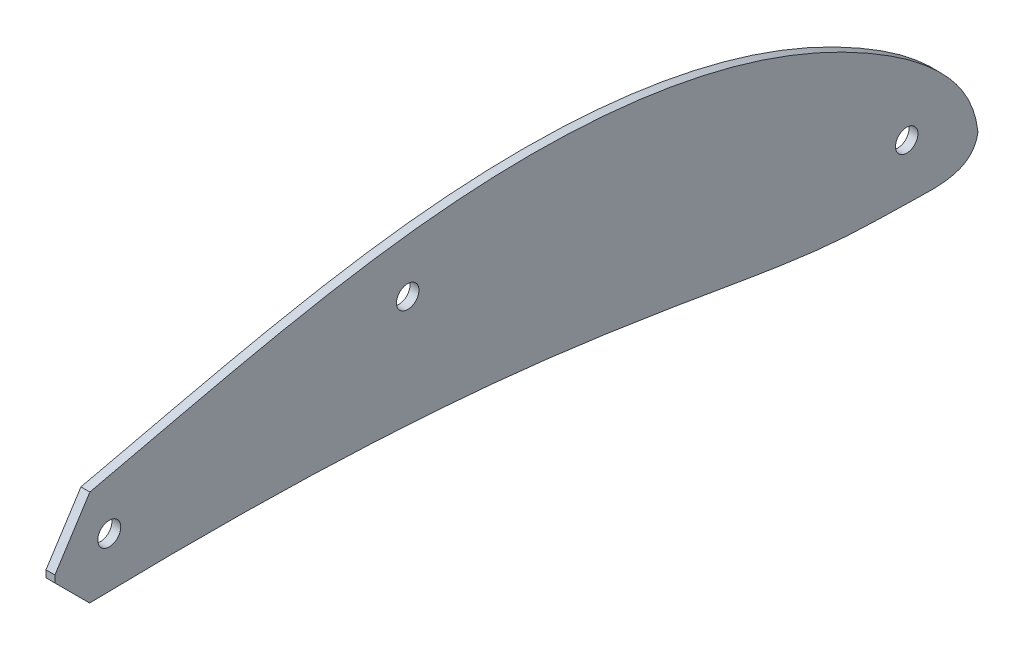
ISO-10303-21;
HEADER;
FILE_DESCRIPTION(('STEP AP214'),'2;1');
FILE_NAME('part.step','',(''),(''),'','','');
FILE_SCHEMA(('AUTOMOTIVE_DESIGN { 1 0 10303 214 1 1 1 1 }'));
ENDSEC;
DATA;
#1=APPLICATION_CONTEXT('core data for automotive mechanical design processes');
#2=APPLICATION_PROTOCOL_DEFINITION('international standard','automotive_design',2000,#1);
#3=PRODUCT_CONTEXT('',#1,'mechanical');
#4=PRODUCT('Part','Part','',(#3));
#5=PRODUCT_RELATED_PRODUCT_CATEGORY('part','',(#4));
#6=PRODUCT_DEFINITION_FORMATION('','',#4);
#7=PRODUCT_DEFINITION_CONTEXT('part definition',#1,'design');
#8=PRODUCT_DEFINITION('design','',#6,#7);
#9=PRODUCT_DEFINITION_SHAPE('','',#8);
#10=(LENGTH_UNIT() NAMED_UNIT(*) SI_UNIT(.MILLI.,.METRE.));
#11=(NAMED_UNIT(*) PLANE_ANGLE_UNIT() SI_UNIT($,.RADIAN.));
#12=(NAMED_UNIT(*) SI_UNIT($,.STERADIAN.) SOLID_ANGLE_UNIT());
#13=UNCERTAINTY_MEASURE_WITH_UNIT(LENGTH_MEASURE(1.E-05),#10,'distance_accuracy_value','');
#14=(GEOMETRIC_REPRESENTATION_CONTEXT(3) GLOBAL_UNCERTAINTY_ASSIGNED_CONTEXT((#13)) GLOBAL_UNIT_ASSIGNED_CONTEXT((#10,
#11,#12)) REPRESENTATION_CONTEXT('',''));
#15=CARTESIAN_POINT('',(0.,0.,0.));
#16=DIRECTION('',(0.,0.,1.));
#17=DIRECTION('',(1.,0.,0.));
#18=AXIS2_PLACEMENT_3D('',#15,#16,#17);
#19=CARTESIAN_POINT('',(51.564,15.4406002606928,222.336628160272));
#20=DIRECTION('',(0.,1.44492661498854E-12,-1.));
#21=DIRECTION('',(0.,1.,1.44492661498854E-12));
#22=AXIS2_PLACEMENT_3D('',#19,#20,#21);
#23=PLANE('',#22);
#24=DIRECTION('',(0.,-1.,-1.44492661498854E-12));
#25=VECTOR('',#24,1.);
#26=CARTESIAN_POINT('',(-252.4125,15.4406002606927,222.336628160272));
#27=LINE('',#26,#25);
#28=CARTESIAN_POINT('',(-252.4125,19.7638716183474,222.336628160278));
#29=VERTEX_POINT('',#28);
#30=CARTESIAN_POINT('',(-252.4125,18.5250725821856,222.336628160277));
#31=VERTEX_POINT('',#30);
#32=EDGE_CURVE('E617',#29,#31,#27,.T.);
#33=ORIENTED_EDGE('',*,*,#32,.F.);
#34=DIRECTION('',(-1.,0.,0.));
#35=VECTOR('',#34,1.);
#36=CARTESIAN_POINT('',(51.564,19.7638716183474,222.336628160278));
#37=LINE('',#36,#35);
#38=CARTESIAN_POINT('',(-254.,19.7638716183474,222.336628160278));
#39=VERTEX_POINT('',#38);
#40=EDGE_CURVE('E626',#29,#39,#37,.T.);
#41=ORIENTED_EDGE('',*,*,#40,.T.);
#42=DIRECTION('',(0.,-1.,-1.44993065840349E-12));
#43=VECTOR('',#42,1.);
#44=CARTESIAN_POINT('',(-254.,24.8516053073634,222.336628160286));
#45=LINE('',#44,#43);
#46=CARTESIAN_POINT('',(-254.,18.5250725821856,222.336628160277));
#47=VERTEX_POINT('',#46);
#48=EDGE_CURVE('E650',#39,#47,#45,.T.);
#49=ORIENTED_EDGE('',*,*,#48,.T.);
#50=DIRECTION('',(1.,0.,0.));
#51=VECTOR('',#50,1.);
#52=CARTESIAN_POINT('',(51.564,18.5250725821856,222.336628160277));
#53=LINE('',#52,#51);
#54=EDGE_CURVE('E628',#47,#31,#53,.T.);
#55=ORIENTED_EDGE('',*,*,#54,.T.);
#56=EDGE_LOOP('',(#33,#41,#49,#55));
#57=FACE_BOUND('',#56,.T.);
#58=ADVANCED_FACE('F565',(#57),#23,.F.);
#59=CARTESIAN_POINT('',(51.564,5.89579588539861,57.8876602686386));
#60=CARTESIAN_POINT('',(51.564,11.4375298185041,58.4977039922272));
#61=CARTESIAN_POINT('',(51.564,19.3424786806868,64.4003558423215));
#62=CARTESIAN_POINT('',(51.564,28.468473074538,77.6824198998625));
#63=CARTESIAN_POINT('',(51.564,37.5748623123411,97.1285534265328));
#64=CARTESIAN_POINT('',(51.564,43.0194934329442,125.362969322304));
#65=CARTESIAN_POINT('',(51.564,41.5069186372436,169.207920796175));
#66=CARTESIAN_POINT('',(51.564,32.6348292698958,201.329645296342));
#67=CARTESIAN_POINT('',(51.564,28.067577517069,222.336628160291));
#68=B_SPLINE_CURVE_WITH_KNOTS('',3,(#59,#60,#61,#62,#63,#64,#65,#66,#67),.UNSPECIFIED.,.F.,.F.,
(4,1,1,1,1,1,4),(0.,0.0865869930935198,0.16173742787457,0.268322265449627,0.445156626621206,
0.638028872876503,1.),.UNSPECIFIED.);
#69=DIRECTION('',(-1.,0.,0.));
#70=VECTOR('',#69,1.);
#71=SURFACE_OF_LINEAR_EXTRUSION('',#68,#70);
#72=CARTESIAN_POINT('',(-252.4125,5.89579588539861,57.8876602686386));
#73=CARTESIAN_POINT('',(-252.4125,11.4375298185041,58.4977039922272));
#74=CARTESIAN_POINT('',(-252.4125,19.3424786806868,64.4003558423215));
#75=CARTESIAN_POINT('',(-252.4125,28.468473074538,77.6824198998625));
#76=CARTESIAN_POINT('',(-252.4125,37.5748623123411,97.1285534265328));
#77=CARTESIAN_POINT('',(-252.4125,43.0194934329442,125.362969322304));
#78=CARTESIAN_POINT('',(-252.4125,41.5069186372436,169.207920796175));
#79=CARTESIAN_POINT('',(-252.4125,32.6348292698958,201.329645296342));
#80=CARTESIAN_POINT('',(-252.4125,28.067577517069,222.336628160291));
#81=B_SPLINE_CURVE_WITH_KNOTS('',3,(#72,#73,#74,#75,#76,#77,#78,#79,#80),.UNSPECIFIED.,.F.,.F.,
(4,1,1,1,1,1,4),(0.,0.0865869930935198,0.16173742787457,0.268322265449627,0.445156626621206,
0.638028872876503,1.),.UNSPECIFIED.);
#82=CARTESIAN_POINT('',(-252.4125,5.89579588539861,57.8876602686386));
#83=VERTEX_POINT('',#82);
#84=CARTESIAN_POINT('',(-252.4125,29.453439208678,216.107941821354));
#85=VERTEX_POINT('',#84);
#86=EDGE_CURVE('E584',#83,#85,#81,.T.);
#87=ORIENTED_EDGE('',*,*,#86,.F.);
#88=DIRECTION('',(-1.,0.,0.));
#89=VECTOR('',#88,1.);
#90=CARTESIAN_POINT('',(51.564,5.89579588539861,57.8876602686386));
#91=LINE('',#90,#89);
#92=CARTESIAN_POINT('',(-254.,5.89579588539861,57.8876602686386));
#93=VERTEX_POINT('',#92);
#94=EDGE_CURVE('E570',#83,#93,#91,.T.);
#95=ORIENTED_EDGE('',*,*,#94,.T.);
#96=CARTESIAN_POINT('',(-254.,5.89579588539861,57.8876602686386));
#97=CARTESIAN_POINT('',(-254.,11.4375298185041,58.4977039922272));
#98=CARTESIAN_POINT('',(-254.,19.3424786806868,64.4003558423215));
#99=CARTESIAN_POINT('',(-254.,28.468473074538,77.6824198998625));
#100=CARTESIAN_POINT('',(-254.,37.5748623123411,97.1285534265328));
#101=CARTESIAN_POINT('',(-254.,43.0194934329442,125.362969322304));
#102=CARTESIAN_POINT('',(-254.,41.5069186372436,169.207920796175));
#103=CARTESIAN_POINT('',(-254.,32.6348292698958,201.329645296342));
#104=CARTESIAN_POINT('',(-254.,28.067577517069,222.336628160291));
#105=B_SPLINE_CURVE_WITH_KNOTS('',3,(#96,#97,#98,#99,#100,#101,#102,#103,#104),.UNSPECIFIED.,
.F.,.F.,(4,1,1,1,1,1,4),(0.,0.0865869930935198,0.16173742787457,0.268322265449627,
0.445156626621206,0.638028872876503,1.),.UNSPECIFIED.);
#106=CARTESIAN_POINT('',(-254.,29.453439208678,216.107941821354));
#107=VERTEX_POINT('',#106);
#108=EDGE_CURVE('E645',#93,#107,#105,.T.);
#109=ORIENTED_EDGE('',*,*,#108,.T.);
#110=DIRECTION('',(-1.,0.,0.));
#111=VECTOR('',#110,1.);
#112=CARTESIAN_POINT('',(-254.,29.453439208678,216.107941821354));
#113=LINE('',#112,#111);
#114=EDGE_CURVE('E577',#107,#85,#113,.F.);
#115=ORIENTED_EDGE('',*,*,#114,.T.);
#116=EDGE_LOOP('',(#87,#95,#109,#115));
#117=FACE_BOUND('',#116,.T.);
#118=ADVANCED_FACE('F643',(#117),#71,.F.);
#119=CARTESIAN_POINT('',(51.564,12.1750725821855,222.336628160268));
#120=CARTESIAN_POINT('',(51.564,13.0264646632632,193.680569664148));
#121=CARTESIAN_POINT('',(51.564,12.6013501035627,154.402001186683));
#122=CARTESIAN_POINT('',(51.564,5.45323272198308,107.967999962241));
#123=CARTESIAN_POINT('',(51.564,1.30332527226234,85.3393891083057));
#124=CARTESIAN_POINT('',(51.564,1.23503708265966,69.4212938685485));
#125=CARTESIAN_POINT('',(51.564,0.681560257657299,58.8140260385803));
#126=CARTESIAN_POINT('',(51.564,5.89579588539861,57.8876602686386));
#127=B_SPLINE_CURVE_WITH_KNOTS('',3,(#119,#120,#121,#122,#123,#124,#125,#126),.UNSPECIFIED.,.F.,
.F.,(4,1,1,1,1,4),(0.,0.517329721776624,0.696666541434988,0.84940993817877,0.919519723249622,
1.),.UNSPECIFIED.);
#128=DIRECTION('',(-1.,0.,0.));
#129=VECTOR('',#128,1.);
#130=SURFACE_OF_LINEAR_EXTRUSION('',#127,#129);
#131=CARTESIAN_POINT('',(-252.4125,12.1750725821855,222.336628160268));
#132=CARTESIAN_POINT('',(-252.4125,13.0264646632632,193.680569664148));
#133=CARTESIAN_POINT('',(-252.4125,12.6013501035627,154.402001186683));
#134=CARTESIAN_POINT('',(-252.4125,5.45323272198308,107.967999962241));
#135=CARTESIAN_POINT('',(-252.4125,1.30332527226234,85.3393891083057));
#136=CARTESIAN_POINT('',(-252.4125,1.23503708265966,69.4212938685485));
#137=CARTESIAN_POINT('',(-252.4125,0.681560257657299,58.8140260385803));
#138=CARTESIAN_POINT('',(-252.4125,5.89579588539861,57.8876602686386));
#139=B_SPLINE_CURVE_WITH_KNOTS('',3,(#131,#132,#133,#134,#135,#136,#137,#138),.UNSPECIFIED.,.F.,
.F.,(4,1,1,1,1,4),(0.,0.517329721776624,0.696666541434988,0.84940993817877,0.919519723249622,
1.),.UNSPECIFIED.);
#140=CARTESIAN_POINT('',(-252.4125,12.3398575856837,216.151413163986));
#141=VERTEX_POINT('',#140);
#142=EDGE_CURVE('E702',#141,#83,#139,.T.);
#143=ORIENTED_EDGE('',*,*,#142,.F.);
#144=DIRECTION('',(-1.,0.,0.));
#145=VECTOR('',#144,1.);
#146=CARTESIAN_POINT('',(-228.6,12.3398575856837,216.151413163986));
#147=LINE('',#146,#145);
#148=CARTESIAN_POINT('',(-254.,12.3398575856837,216.151413163986));
#149=VERTEX_POINT('',#148);
#150=EDGE_CURVE('E649',#141,#149,#147,.T.);
#151=ORIENTED_EDGE('',*,*,#150,.T.);
#152=CARTESIAN_POINT('',(-254.,12.1750725821855,222.336628160268));
#153=CARTESIAN_POINT('',(-254.,13.0264646632632,193.680569664148));
#154=CARTESIAN_POINT('',(-254.,12.6013501035627,154.402001186683));
#155=CARTESIAN_POINT('',(-254.,5.45323272198308,107.967999962241));
#156=CARTESIAN_POINT('',(-254.,1.30332527226234,85.3393891083057));
#157=CARTESIAN_POINT('',(-254.,1.23503708265966,69.4212938685485));
#158=CARTESIAN_POINT('',(-254.,0.681560257657299,58.8140260385803));
#159=CARTESIAN_POINT('',(-254.,5.89579588539861,57.8876602686386));
#160=B_SPLINE_CURVE_WITH_KNOTS('',3,(#152,#153,#154,#155,#156,#157,#158,#159),.UNSPECIFIED.,.F.,
.F.,(4,1,1,1,1,4),(0.,0.517329721776624,0.696666541434988,0.84940993817877,0.919519723249622,
1.),.UNSPECIFIED.);
#161=EDGE_CURVE('E655',#149,#93,#160,.T.);
#162=ORIENTED_EDGE('',*,*,#161,.T.);
#163=ORIENTED_EDGE('',*,*,#94,.F.);
#164=EDGE_LOOP('',(#143,#151,#162,#163));
#165=FACE_BOUND('',#164,.T.);
#166=ADVANCED_FACE('F680',(#165),#130,.F.);
#167=CARTESIAN_POINT('',(254.000025,21.3157055450587,212.654188465474));
#168=DIRECTION('',(-1.,0.,0.));
#169=DIRECTION('',(0.,-1.,0.));
#170=AXIS2_PLACEMENT_3D('',#167,#168,#169);
#171=CYLINDRICAL_SURFACE('',#170,2.04999999999999);
#172=CARTESIAN_POINT('',(-254.,21.3157055450588,212.654188465474));
#173=DIRECTION('',(-1.,0.,0.));
#174=DIRECTION('',(0.,0.,1.));
#175=AXIS2_PLACEMENT_3D('',#172,#173,#174);
#176=CIRCLE('',#175,2.04999999999999);
#177=CARTESIAN_POINT('',(-254.,19.2657055450588,212.654188465474));
#178=VERTEX_POINT('',#177);
#179=EDGE_CURVE('E709',#178,#178,#176,.T.);
#180=CARTESIAN_POINT('',(-252.4125,21.3157055450588,212.654188465474));
#181=DIRECTION('',(1.,0.,0.));
#182=DIRECTION('',(0.,1.,0.));
#183=AXIS2_PLACEMENT_3D('',#180,#181,#182);
#184=CIRCLE('',#183,2.04999999999999);
#185=CARTESIAN_POINT('',(-252.4125,19.2657055450588,212.654188465474));
#186=VERTEX_POINT('',#185);
#187=EDGE_CURVE('E704',#186,#186,#184,.F.);
#188=CARTESIAN_POINT('',(-254.,19.2657055450588,212.654188465474));
#189=CARTESIAN_POINT('',(-253.983463541667,19.2657055450588,212.654188465474));
#190=CARTESIAN_POINT('',(-253.966927083333,19.2657055450588,212.654188465474));
#191=CARTESIAN_POINT('',(-253.933854166667,19.2657055450588,212.654188465474));
#192=CARTESIAN_POINT('',(-253.917317708333,19.2657055450588,212.654188465474));
#193=CARTESIAN_POINT('',(-253.884244791667,19.2657055450588,212.654188465474));
#194=CARTESIAN_POINT('',(-253.867708333333,19.2657055450588,212.654188465474));
#195=CARTESIAN_POINT('',(-253.834635416667,19.2657055450588,212.654188465474));
#196=CARTESIAN_POINT('',(-253.818098958333,19.2657055450588,212.654188465474));
#197=CARTESIAN_POINT('',(-253.785026041667,19.2657055450588,212.654188465474));
#198=CARTESIAN_POINT('',(-253.768489583333,19.2657055450588,212.654188465474));
#199=CARTESIAN_POINT('',(-253.735416666667,19.2657055450588,212.654188465474));
#200=CARTESIAN_POINT('',(-253.718880208333,19.2657055450588,212.654188465474));
#201=CARTESIAN_POINT('',(-253.685807291667,19.2657055450588,212.654188465474));
#202=CARTESIAN_POINT('',(-253.669270833333,19.2657055450588,212.654188465474));
#203=CARTESIAN_POINT('',(-253.636197916667,19.2657055450588,212.654188465474));
#204=CARTESIAN_POINT('',(-253.619661458333,19.2657055450588,212.654188465474));
#205=CARTESIAN_POINT('',(-253.586588541667,19.2657055450588,212.654188465474));
#206=CARTESIAN_POINT('',(-253.570052083333,19.2657055450588,212.654188465474));
#207=CARTESIAN_POINT('',(-253.536979166667,19.2657055450588,212.654188465474));
#208=CARTESIAN_POINT('',(-253.520442708333,19.2657055450588,212.654188465474));
#209=CARTESIAN_POINT('',(-253.487369791667,19.2657055450588,212.654188465474));
#210=CARTESIAN_POINT('',(-253.470833333333,19.2657055450588,212.654188465474));
#211=CARTESIAN_POINT('',(-253.437760416667,19.2657055450588,212.654188465474));
#212=CARTESIAN_POINT('',(-253.421223958333,19.2657055450588,212.654188465474));
#213=CARTESIAN_POINT('',(-253.388151041667,19.2657055450588,212.654188465474));
#214=CARTESIAN_POINT('',(-253.371614583333,19.2657055450588,212.654188465474));
#215=CARTESIAN_POINT('',(-253.338541666667,19.2657055450588,212.654188465474));
#216=CARTESIAN_POINT('',(-253.322005208333,19.2657055450588,212.654188465474));
#217=CARTESIAN_POINT('',(-253.288932291667,19.2657055450588,212.654188465474));
#218=CARTESIAN_POINT('',(-253.272395833333,19.2657055450588,212.654188465474));
#219=CARTESIAN_POINT('',(-253.239322916667,19.2657055450588,212.654188465474));
#220=CARTESIAN_POINT('',(-253.222786458333,19.2657055450588,212.654188465474));
#221=CARTESIAN_POINT('',(-253.189713541667,19.2657055450588,212.654188465474));
#222=CARTESIAN_POINT('',(-253.173177083333,19.2657055450588,212.654188465474));
#223=CARTESIAN_POINT('',(-253.140104166667,19.2657055450588,212.654188465474));
#224=CARTESIAN_POINT('',(-253.123567708333,19.2657055450588,212.654188465474));
#225=CARTESIAN_POINT('',(-253.090494791667,19.2657055450588,212.654188465474));
#226=CARTESIAN_POINT('',(-253.073958333333,19.2657055450588,212.654188465474));
#227=CARTESIAN_POINT('',(-253.040885416667,19.2657055450588,212.654188465474));
#228=CARTESIAN_POINT('',(-253.024348958333,19.2657055450588,212.654188465474));
#229=CARTESIAN_POINT('',(-252.991276041667,19.2657055450588,212.654188465474));
#230=CARTESIAN_POINT('',(-252.974739583333,19.2657055450588,212.654188465474));
#231=CARTESIAN_POINT('',(-252.941666666667,19.2657055450588,212.654188465474));
#232=CARTESIAN_POINT('',(-252.925130208333,19.2657055450588,212.654188465474));
#233=CARTESIAN_POINT('',(-252.892057291667,19.2657055450588,212.654188465474));
#234=CARTESIAN_POINT('',(-252.875520833333,19.2657055450588,212.654188465474));
#235=CARTESIAN_POINT('',(-252.842447916667,19.2657055450588,212.654188465474));
#236=CARTESIAN_POINT('',(-252.825911458333,19.2657055450588,212.654188465474));
#237=CARTESIAN_POINT('',(-252.792838541667,19.2657055450588,212.654188465474));
#238=CARTESIAN_POINT('',(-252.776302083333,19.2657055450588,212.654188465474));
#239=CARTESIAN_POINT('',(-252.743229166667,19.2657055450588,212.654188465474));
#240=CARTESIAN_POINT('',(-252.726692708333,19.2657055450588,212.654188465474));
#241=CARTESIAN_POINT('',(-252.693619791667,19.2657055450588,212.654188465474));
#242=CARTESIAN_POINT('',(-252.677083333333,19.2657055450588,212.654188465474));
#243=CARTESIAN_POINT('',(-252.644010416667,19.2657055450588,212.654188465474));
#244=CARTESIAN_POINT('',(-252.627473958333,19.2657055450588,212.654188465474));
#245=CARTESIAN_POINT('',(-252.594401041667,19.2657055450588,212.654188465474));
#246=CARTESIAN_POINT('',(-252.577864583333,19.2657055450588,212.654188465474));
#247=CARTESIAN_POINT('',(-252.544791666667,19.2657055450588,212.654188465474));
#248=CARTESIAN_POINT('',(-252.528255208333,19.2657055450588,212.654188465474));
#249=CARTESIAN_POINT('',(-252.495182291667,19.2657055450588,212.654188465474));
#250=CARTESIAN_POINT('',(-252.478645833333,19.2657055450588,212.654188465474));
#251=CARTESIAN_POINT('',(-252.445572916667,19.2657055450588,212.654188465474));
#252=CARTESIAN_POINT('',(-252.429036458333,19.2657055450588,212.654188465474));
#253=CARTESIAN_POINT('',(-252.4125,19.2657055450588,212.654188465474));
#254=B_SPLINE_CURVE_WITH_KNOTS('',3,(#188,#189,#190,#191,#192,#193,#194,#195,#196,#197,#198,
#199,#200,#201,#202,#203,#204,#205,#206,#207,#208,#209,#210,#211,#212,#213,#214,#215,#216,#217,
#218,#219,#220,#221,#222,#223,#224,#225,#226,#227,#228,#229,#230,#231,#232,#233,#234,#235,#236,
#237,#238,#239,#240,#241,#242,#243,#244,#245,#246,#247,#248,#249,#250,#251,#252,#253),
.UNSPECIFIED.,.F.,.F.,(4,2,2,2,2,2,2,2,2,2,2,2,2,2,2,2,2,2,2,2,2,2,2,2,2,2,2,2,2,2,2,2,4),(0.,
0.0496093749999815,0.0992187499999631,0.148828125000056,0.198437500000037,0.248046875000019,
0.29765625,0.347265624999982,0.396875000000074,0.446484375000056,0.496093750000037,
0.545703125000019,0.5953125,0.644921874999982,0.694531250000074,0.744140625000056,
0.793750000000037,0.843359375000019,0.892968750000001,0.942578125000093,0.992187500000075,
1.04179687500006,1.09140625000004,1.14101562500002,1.190625,1.24023437500009,1.28984375000007,
1.33945312500006,1.38906250000004,1.43867187500002,1.48828125000011,1.53789062500009,
1.58750000000007),.UNSPECIFIED.);
#255=EDGE_CURVE('BSEAM686',#178,#186,#254,.T.);
#256=ORIENTED_EDGE('',*,*,#179,.T.);
#257=ORIENTED_EDGE('',*,*,#187,.F.);
#258=ORIENTED_EDGE('',*,*,#255,.T.);
#259=ORIENTED_EDGE('',*,*,#255,.F.);
#260=EDGE_LOOP('',(#256,#258,#257,#259));
#261=FACE_BOUND('',#260,.T.);
#262=ADVANCED_FACE('F686',(#261),#171,.F.);
#263=CARTESIAN_POINT('',(-241.3,12.3398575856837,216.151413163986));
#264=DIRECTION('',(0.,0.707106781174496,-0.707106781198599));
#265=DIRECTION('',(-1.,0.,0.));
#266=AXIS2_PLACEMENT_3D('',#263,#264,#265);
#267=PLANE('',#266);
#268=ORIENTED_EDGE('',*,*,#150,.F.);
#269=DIRECTION('',(0.,-0.707106781198599,-0.707106781174496));
#270=VECTOR('',#269,1.);
#271=CARTESIAN_POINT('',(-252.4125,12.3398575856837,216.151413163986));
#272=LINE('',#271,#270);
#273=EDGE_CURVE('E630',#141,#31,#272,.F.);
#274=ORIENTED_EDGE('',*,*,#273,.T.);
#275=ORIENTED_EDGE('',*,*,#54,.F.);
#276=DIRECTION('',(0.,-0.707106781198599,-0.707106781174496));
#277=VECTOR('',#276,1.);
#278=CARTESIAN_POINT('',(-254.,-13.6682463863381,190.14330919285));
#279=LINE('',#278,#277);
#280=EDGE_CURVE('E633',#149,#47,#279,.F.);
#281=ORIENTED_EDGE('',*,*,#280,.F.);
#282=EDGE_LOOP('',(#268,#274,#275,#281));
#283=FACE_BOUND('',#282,.T.);
#284=ADVANCED_FACE('F689',(#283),#267,.F.);
#285=CARTESIAN_POINT('',(-241.3,19.7638716183474,222.336628160278));
#286=DIRECTION('',(0.,-0.540737848334989,-0.841191166963876));
#287=DIRECTION('',(-1.,0.,0.));
#288=AXIS2_PLACEMENT_3D('',#285,#286,#287);
#289=PLANE('',#288);
#290=ORIENTED_EDGE('',*,*,#40,.F.);
#291=DIRECTION('',(0.,-0.841191166963876,0.540737848334989));
#292=VECTOR('',#291,1.);
#293=CARTESIAN_POINT('',(-252.4125,19.7638716183474,222.336628160278));
#294=LINE('',#293,#292);
#295=EDGE_CURVE('E12',#29,#85,#294,.F.);
#296=ORIENTED_EDGE('',*,*,#295,.T.);
#297=ORIENTED_EDGE('',*,*,#114,.F.);
#298=DIRECTION('',(0.,-0.841191166963876,0.540737848334989));
#299=VECTOR('',#298,1.);
#300=CARTESIAN_POINT('',(-254.,75.6879031087807,186.387320029165));
#301=LINE('',#300,#299);
#302=EDGE_CURVE('E591',#39,#107,#301,.F.);
#303=ORIENTED_EDGE('',*,*,#302,.F.);
#304=EDGE_LOOP('',(#290,#296,#297,#303));
#305=FACE_BOUND('',#304,.T.);
#306=ADVANCED_FACE('F568',(#305),#289,.F.);
#307=CARTESIAN_POINT('',(-254.,42.1932402112303,134.281822593378));
#308=DIRECTION('',(-1.,0.,0.));
#309=DIRECTION('',(0.,0.,1.));
#310=AXIS2_PLACEMENT_3D('',#307,#308,#309);
#311=PLANE('',#310);
#312=CARTESIAN_POINT('',(-254.,10.9757958853986,70.5876602686386));
#313=DIRECTION('',(-1.,0.,0.));
#314=DIRECTION('',(0.,0.,1.));
#315=AXIS2_PLACEMENT_3D('',#312,#313,#314);
#316=CIRCLE('',#315,2.);
#317=CARTESIAN_POINT('',(-254.,10.9757958853986,72.5876602686386));
#318=VERTEX_POINT('',#317);
#319=EDGE_CURVE('E736',#318,#318,#316,.T.);
#320=ORIENTED_EDGE('',*,*,#319,.F.);
#321=EDGE_LOOP('',(#320));
#322=FACE_BOUND('',#321,.T.);
#323=CARTESIAN_POINT('',(-254.,31.2957958853986,159.487660268639));
#324=DIRECTION('',(-1.,0.,0.));
#325=DIRECTION('',(0.,0.,1.));
#326=AXIS2_PLACEMENT_3D('',#323,#324,#325);
#327=CIRCLE('',#326,2.);
#328=CARTESIAN_POINT('',(-254.,31.2957958853986,161.487660268639));
#329=VERTEX_POINT('',#328);
#330=EDGE_CURVE('E739',#329,#329,#327,.T.);
#331=ORIENTED_EDGE('',*,*,#330,.F.);
#332=EDGE_LOOP('',(#331));
#333=FACE_BOUND('',#332,.T.);
#334=ORIENTED_EDGE('',*,*,#179,.F.);
#335=EDGE_LOOP('',(#334));
#336=FACE_BOUND('',#335,.T.);
#337=ORIENTED_EDGE('',*,*,#161,.F.);
#338=ORIENTED_EDGE('',*,*,#280,.T.);
#339=ORIENTED_EDGE('',*,*,#48,.F.);
#340=ORIENTED_EDGE('',*,*,#302,.T.);
#341=ORIENTED_EDGE('',*,*,#108,.F.);
#342=EDGE_LOOP('',(#337,#338,#339,#340,#341));
#343=FACE_BOUND('',#342,.T.);
#344=ADVANCED_FACE('F681',(#322,#333,#336,#343),#311,.T.);
#345=CARTESIAN_POINT('',(-252.4125,249.356885044254,248.601164773977));
#346=DIRECTION('',(1.,0.,0.));
#347=DIRECTION('',(0.,1.,0.));
#348=AXIS2_PLACEMENT_3D('',#345,#346,#347);
#349=PLANE('',#348);
#350=CARTESIAN_POINT('',(-252.4125,10.9757958853986,70.5876602686386));
#351=DIRECTION('',(-1.,0.,0.));
#352=DIRECTION('',(0.,0.,1.));
#353=AXIS2_PLACEMENT_3D('',#350,#351,#352);
#354=CIRCLE('',#353,2.);
#355=CARTESIAN_POINT('',(-252.4125,10.9757958853986,72.5876602686386));
#356=VERTEX_POINT('',#355);
#357=EDGE_CURVE('E752',#356,#356,#354,.T.);
#358=ORIENTED_EDGE('',*,*,#357,.T.);
#359=EDGE_LOOP('',(#358));
#360=FACE_BOUND('',#359,.T.);
#361=CARTESIAN_POINT('',(-252.4125,31.2957958853986,159.487660268639));
#362=DIRECTION('',(-1.,0.,0.));
#363=DIRECTION('',(0.,0.,1.));
#364=AXIS2_PLACEMENT_3D('',#361,#362,#363);
#365=CIRCLE('',#364,2.);
#366=CARTESIAN_POINT('',(-252.4125,31.2957958853986,161.487660268639));
#367=VERTEX_POINT('',#366);
#368=EDGE_CURVE('E742',#367,#367,#365,.T.);
#369=ORIENTED_EDGE('',*,*,#368,.T.);
#370=EDGE_LOOP('',(#369));
#371=FACE_BOUND('',#370,.T.);
#372=ORIENTED_EDGE('',*,*,#142,.T.);
#373=ORIENTED_EDGE('',*,*,#86,.T.);
#374=ORIENTED_EDGE('',*,*,#295,.F.);
#375=ORIENTED_EDGE('',*,*,#32,.T.);
#376=ORIENTED_EDGE('',*,*,#273,.F.);
#377=EDGE_LOOP('',(#372,#373,#374,#375,#376));
#378=FACE_BOUND('',#377,.T.);
#379=ORIENTED_EDGE('',*,*,#187,.T.);
#380=EDGE_LOOP('',(#379));
#381=FACE_BOUND('',#380,.T.);
#382=ADVANCED_FACE('F615',(#360,#371,#378,#381),#349,.T.);
#383=CARTESIAN_POINT('',(-252.4125,31.2957958853986,159.487660268639));
#384=DIRECTION('',(-1.,0.,0.));
#385=DIRECTION('',(0.,0.,1.));
#386=AXIS2_PLACEMENT_3D('',#383,#384,#385);
#387=CYLINDRICAL_SURFACE('',#386,2.);
#388=ORIENTED_EDGE('',*,*,#368,.F.);
#389=EDGE_LOOP('',(#388));
#390=FACE_BOUND('',#389,.T.);
#391=ORIENTED_EDGE('',*,*,#330,.T.);
#392=EDGE_LOOP('',(#391));
#393=FACE_BOUND('',#392,.T.);
#394=ADVANCED_FACE('F730',(#390,#393),#387,.F.);
#395=CARTESIAN_POINT('',(-252.4125,10.9757958853986,70.5876602686386));
#396=DIRECTION('',(-1.,0.,0.));
#397=DIRECTION('',(0.,0.,1.));
#398=AXIS2_PLACEMENT_3D('',#395,#396,#397);
#399=CYLINDRICAL_SURFACE('',#398,2.);
#400=ORIENTED_EDGE('',*,*,#357,.F.);
#401=EDGE_LOOP('',(#400));
#402=FACE_BOUND('',#401,.T.);
#403=ORIENTED_EDGE('',*,*,#319,.T.);
#404=EDGE_LOOP('',(#403));
#405=FACE_BOUND('',#404,.T.);
#406=ADVANCED_FACE('F762',(#402,#405),#399,.F.);
#407=CLOSED_SHELL('',(#58,#118,#166,#262,#284,#306,#344,#382,#394,#406));
#408=MANIFOLD_SOLID_BREP('B2',#407);
#409=ADVANCED_BREP_SHAPE_REPRESENTATION('',(#18,#408),#14);
#410=SHAPE_DEFINITION_REPRESENTATION(#9,#409);
ENDSEC;
END-ISO-10303-21;
